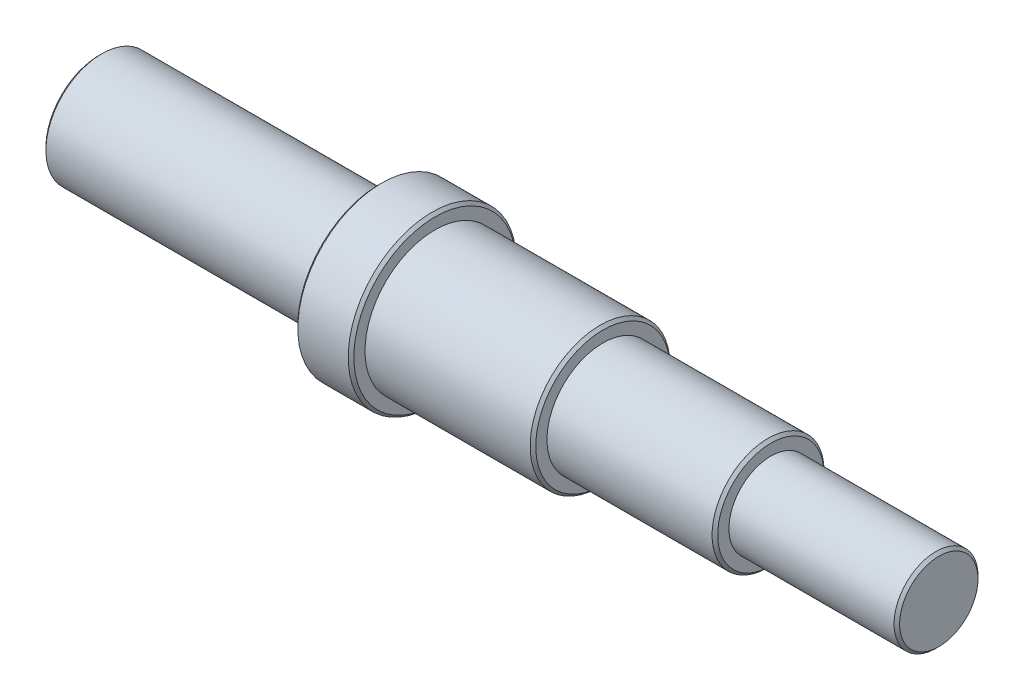
ISO-10303-21;
HEADER;
FILE_DESCRIPTION(('STEP AP214'),'2;1');
FILE_NAME('part.step','',(''),(''),'','','');
FILE_SCHEMA(('AUTOMOTIVE_DESIGN { 1 0 10303 214 1 1 1 1 }'));
ENDSEC;
DATA;
#1=APPLICATION_CONTEXT('core data for automotive mechanical design processes');
#2=APPLICATION_PROTOCOL_DEFINITION('international standard','automotive_design',2000,#1);
#3=PRODUCT_CONTEXT('',#1,'mechanical');
#4=PRODUCT('Part','Part','',(#3));
#5=PRODUCT_RELATED_PRODUCT_CATEGORY('part','',(#4));
#6=PRODUCT_DEFINITION_FORMATION('','',#4);
#7=PRODUCT_DEFINITION_CONTEXT('part definition',#1,'design');
#8=PRODUCT_DEFINITION('design','',#6,#7);
#9=PRODUCT_DEFINITION_SHAPE('','',#8);
#10=(LENGTH_UNIT() NAMED_UNIT(*) SI_UNIT(.MILLI.,.METRE.));
#11=(NAMED_UNIT(*) PLANE_ANGLE_UNIT() SI_UNIT($,.RADIAN.));
#12=(NAMED_UNIT(*) SI_UNIT($,.STERADIAN.) SOLID_ANGLE_UNIT());
#13=UNCERTAINTY_MEASURE_WITH_UNIT(LENGTH_MEASURE(1.E-05),#10,'distance_accuracy_value','');
#14=(GEOMETRIC_REPRESENTATION_CONTEXT(3) GLOBAL_UNCERTAINTY_ASSIGNED_CONTEXT((#13)) GLOBAL_UNIT_ASSIGNED_CONTEXT((#10,
#11,#12)) REPRESENTATION_CONTEXT('',''));
#15=CARTESIAN_POINT('',(0.,0.,0.));
#16=DIRECTION('',(0.,0.,1.));
#17=DIRECTION('',(1.,0.,0.));
#18=AXIS2_PLACEMENT_3D('',#15,#16,#17);
#19=CARTESIAN_POINT('',(50.,0.,0.));
#20=DIRECTION('',(-1.,0.,0.));
#21=DIRECTION('',(0.,0.,1.));
#22=AXIS2_PLACEMENT_3D('',#19,#20,#21);
#23=CYLINDRICAL_SURFACE('',#22,10.);
#24=CARTESIAN_POINT('',(0.499999999999987,0.,0.));
#25=DIRECTION('',(1.,0.,0.));
#26=DIRECTION('',(0.,0.,-1.));
#27=AXIS2_PLACEMENT_3D('',#24,#25,#26);
#28=CIRCLE('',#27,10.);
#29=CARTESIAN_POINT('',(0.499999999999987,0.,-10.));
#30=VERTEX_POINT('',#29);
#31=EDGE_CURVE('E82',#30,#30,#28,.T.);
#32=ORIENTED_EDGE('',*,*,#31,.T.);
#33=EDGE_LOOP('',(#32));
#34=FACE_BOUND('',#33,.T.);
#35=CARTESIAN_POINT('',(50.,0.,0.));
#36=DIRECTION('',(1.,0.,0.));
#37=DIRECTION('',(0.,0.,-1.));
#38=AXIS2_PLACEMENT_3D('',#35,#36,#37);
#39=CIRCLE('',#38,10.);
#40=CARTESIAN_POINT('',(50.,0.,-10.));
#41=VERTEX_POINT('',#40);
#42=EDGE_CURVE('E85',#41,#41,#39,.T.);
#43=ORIENTED_EDGE('',*,*,#42,.F.);
#44=EDGE_LOOP('',(#43));
#45=FACE_BOUND('',#44,.T.);
#46=ADVANCED_FACE('F35',(#34,#45),#23,.T.);
#47=CARTESIAN_POINT('',(0.,0.,0.));
#48=DIRECTION('',(1.,0.,0.));
#49=DIRECTION('',(0.,0.,-1.));
#50=AXIS2_PLACEMENT_3D('',#47,#48,#49);
#51=PLANE('',#50);
#52=CARTESIAN_POINT('',(0.,0.,0.));
#53=DIRECTION('',(1.,0.,0.));
#54=DIRECTION('',(0.,0.,-1.));
#55=AXIS2_PLACEMENT_3D('',#52,#53,#54);
#56=CIRCLE('',#55,9.50000000000001);
#57=CARTESIAN_POINT('',(0.,0.,-9.50000000000001));
#58=VERTEX_POINT('',#57);
#59=EDGE_CURVE('E79',#58,#58,#56,.F.);
#60=ORIENTED_EDGE('',*,*,#59,.T.);
#61=EDGE_LOOP('',(#60));
#62=FACE_BOUND('',#61,.T.);
#63=ADVANCED_FACE('F116',(#62),#51,.F.);
#64=CARTESIAN_POINT('',(0.499999999999987,0.,0.));
#65=DIRECTION('',(1.,0.,0.));
#66=DIRECTION('',(0.,0.,-1.));
#67=AXIS2_PLACEMENT_3D('',#64,#65,#66);
#68=CONICAL_SURFACE('',#67,10.,0.785398163397454);
#69=ORIENTED_EDGE('',*,*,#59,.F.);
#70=EDGE_LOOP('',(#69));
#71=FACE_BOUND('',#70,.T.);
#72=ORIENTED_EDGE('',*,*,#31,.F.);
#73=EDGE_LOOP('',(#72));
#74=FACE_BOUND('',#73,.T.);
#75=ADVANCED_FACE('F122',(#71,#74),#68,.T.);
#76=CARTESIAN_POINT('',(60.,0.,0.));
#77=DIRECTION('',(-1.,0.,0.));
#78=DIRECTION('',(0.,0.,1.));
#79=AXIS2_PLACEMENT_3D('',#76,#77,#78);
#80=CYLINDRICAL_SURFACE('',#79,15.);
#81=CARTESIAN_POINT('',(59.5,0.,0.));
#82=DIRECTION('',(1.,0.,0.));
#83=DIRECTION('',(0.,0.,-1.));
#84=AXIS2_PLACEMENT_3D('',#81,#82,#83);
#85=CIRCLE('',#84,15.);
#86=CARTESIAN_POINT('',(59.5,0.,-15.));
#87=VERTEX_POINT('',#86);
#88=EDGE_CURVE('E67',#87,#87,#85,.F.);
#89=ORIENTED_EDGE('',*,*,#88,.T.);
#90=EDGE_LOOP('',(#89));
#91=FACE_BOUND('',#90,.T.);
#92=CARTESIAN_POINT('',(50.5,0.,0.));
#93=DIRECTION('',(1.,0.,0.));
#94=DIRECTION('',(0.,0.,-1.));
#95=AXIS2_PLACEMENT_3D('',#92,#93,#94);
#96=CIRCLE('',#95,15.);
#97=CARTESIAN_POINT('',(50.5,0.,-15.));
#98=VERTEX_POINT('',#97);
#99=EDGE_CURVE('E76',#98,#98,#96,.T.);
#100=ORIENTED_EDGE('',*,*,#99,.T.);
#101=EDGE_LOOP('',(#100));
#102=FACE_BOUND('',#101,.T.);
#103=ADVANCED_FACE('F134',(#91,#102),#80,.T.);
#104=CARTESIAN_POINT('',(60.,0.,0.));
#105=DIRECTION('',(1.,0.,0.));
#106=DIRECTION('',(0.,0.,-1.));
#107=AXIS2_PLACEMENT_3D('',#104,#105,#106);
#108=PLANE('',#107);
#109=CARTESIAN_POINT('',(60.,0.,0.));
#110=DIRECTION('',(1.,0.,0.));
#111=DIRECTION('',(0.,0.,-1.));
#112=AXIS2_PLACEMENT_3D('',#109,#110,#111);
#113=CIRCLE('',#112,12.5);
#114=CARTESIAN_POINT('',(60.,0.,-12.5));
#115=VERTEX_POINT('',#114);
#116=EDGE_CURVE('E66',#115,#115,#113,.T.);
#117=ORIENTED_EDGE('',*,*,#116,.F.);
#118=EDGE_LOOP('',(#117));
#119=FACE_BOUND('',#118,.T.);
#120=CARTESIAN_POINT('',(60.,0.,0.));
#121=DIRECTION('',(1.,0.,0.));
#122=DIRECTION('',(0.,0.,-1.));
#123=AXIS2_PLACEMENT_3D('',#120,#121,#122);
#124=CIRCLE('',#123,14.5);
#125=CARTESIAN_POINT('',(60.,0.,-14.5));
#126=VERTEX_POINT('',#125);
#127=EDGE_CURVE('E70',#126,#126,#124,.T.);
#128=ORIENTED_EDGE('',*,*,#127,.T.);
#129=EDGE_LOOP('',(#128));
#130=FACE_BOUND('',#129,.T.);
#131=ADVANCED_FACE('F157',(#119,#130),#108,.T.);
#132=CARTESIAN_POINT('',(50.,0.,0.));
#133=DIRECTION('',(1.,0.,0.));
#134=DIRECTION('',(0.,0.,-1.));
#135=AXIS2_PLACEMENT_3D('',#132,#133,#134);
#136=PLANE('',#135);
#137=CARTESIAN_POINT('',(50.,0.,0.));
#138=DIRECTION('',(1.,0.,0.));
#139=DIRECTION('',(0.,0.,-1.));
#140=AXIS2_PLACEMENT_3D('',#137,#138,#139);
#141=CIRCLE('',#140,14.5);
#142=CARTESIAN_POINT('',(50.,0.,-14.5));
#143=VERTEX_POINT('',#142);
#144=EDGE_CURVE('E73',#143,#143,#141,.F.);
#145=ORIENTED_EDGE('',*,*,#144,.T.);
#146=EDGE_LOOP('',(#145));
#147=FACE_BOUND('',#146,.T.);
#148=ORIENTED_EDGE('',*,*,#42,.T.);
#149=EDGE_LOOP('',(#148));
#150=FACE_BOUND('',#149,.T.);
#151=ADVANCED_FACE('F142',(#147,#150),#136,.F.);
#152=CARTESIAN_POINT('',(50.5,0.,0.));
#153=DIRECTION('',(1.,0.,0.));
#154=DIRECTION('',(0.,0.,-1.));
#155=AXIS2_PLACEMENT_3D('',#152,#153,#154);
#156=CONICAL_SURFACE('',#155,15.,0.785398163397448);
#157=ORIENTED_EDGE('',*,*,#144,.F.);
#158=EDGE_LOOP('',(#157));
#159=FACE_BOUND('',#158,.T.);
#160=ORIENTED_EDGE('',*,*,#99,.F.);
#161=EDGE_LOOP('',(#160));
#162=FACE_BOUND('',#161,.T.);
#163=ADVANCED_FACE('F136',(#159,#162),#156,.T.);
#164=CARTESIAN_POINT('',(60.,0.,0.));
#165=DIRECTION('',(-1.,0.,0.));
#166=DIRECTION('',(0.,0.,1.));
#167=AXIS2_PLACEMENT_3D('',#164,#165,#166);
#168=CONICAL_SURFACE('',#167,14.5,0.785398163397435);
#169=ORIENTED_EDGE('',*,*,#88,.F.);
#170=EDGE_LOOP('',(#169));
#171=FACE_BOUND('',#170,.T.);
#172=ORIENTED_EDGE('',*,*,#127,.F.);
#173=EDGE_LOOP('',(#172));
#174=FACE_BOUND('',#173,.T.);
#175=ADVANCED_FACE('F141',(#171,#174),#168,.T.);
#176=CARTESIAN_POINT('',(90.,0.,0.));
#177=DIRECTION('',(-1.,0.,0.));
#178=DIRECTION('',(0.,0.,1.));
#179=AXIS2_PLACEMENT_3D('',#176,#177,#178);
#180=CYLINDRICAL_SURFACE('',#179,12.5);
#181=CARTESIAN_POINT('',(89.5,0.,0.));
#182=DIRECTION('',(1.,0.,0.));
#183=DIRECTION('',(0.,0.,-1.));
#184=AXIS2_PLACEMENT_3D('',#181,#182,#183);
#185=CIRCLE('',#184,12.5);
#186=CARTESIAN_POINT('',(89.5,0.,-12.5));
#187=VERTEX_POINT('',#186);
#188=EDGE_CURVE('E60',#187,#187,#185,.F.);
#189=ORIENTED_EDGE('',*,*,#188,.T.);
#190=EDGE_LOOP('',(#189));
#191=FACE_BOUND('',#190,.T.);
#192=ORIENTED_EDGE('',*,*,#116,.T.);
#193=EDGE_LOOP('',(#192));
#194=FACE_BOUND('',#193,.T.);
#195=ADVANCED_FACE('F99',(#191,#194),#180,.T.);
#196=CARTESIAN_POINT('',(90.,0.,0.));
#197=DIRECTION('',(1.,0.,0.));
#198=DIRECTION('',(0.,0.,-1.));
#199=AXIS2_PLACEMENT_3D('',#196,#197,#198);
#200=PLANE('',#199);
#201=CARTESIAN_POINT('',(90.,0.,0.));
#202=DIRECTION('',(1.,0.,0.));
#203=DIRECTION('',(0.,0.,-1.));
#204=AXIS2_PLACEMENT_3D('',#201,#202,#203);
#205=CIRCLE('',#204,10.);
#206=CARTESIAN_POINT('',(90.,0.,-10.));
#207=VERTEX_POINT('',#206);
#208=EDGE_CURVE('E59',#207,#207,#205,.T.);
#209=ORIENTED_EDGE('',*,*,#208,.F.);
#210=EDGE_LOOP('',(#209));
#211=FACE_BOUND('',#210,.T.);
#212=CARTESIAN_POINT('',(90.,0.,0.));
#213=DIRECTION('',(1.,0.,0.));
#214=DIRECTION('',(0.,0.,-1.));
#215=AXIS2_PLACEMENT_3D('',#212,#213,#214);
#216=CIRCLE('',#215,12.);
#217=CARTESIAN_POINT('',(90.,0.,-12.));
#218=VERTEX_POINT('',#217);
#219=EDGE_CURVE('E63',#218,#218,#216,.T.);
#220=ORIENTED_EDGE('',*,*,#219,.T.);
#221=EDGE_LOOP('',(#220));
#222=FACE_BOUND('',#221,.T.);
#223=ADVANCED_FACE('F95',(#211,#222),#200,.T.);
#224=CARTESIAN_POINT('',(90.,0.,0.));
#225=DIRECTION('',(-1.,0.,0.));
#226=DIRECTION('',(0.,0.,1.));
#227=AXIS2_PLACEMENT_3D('',#224,#225,#226);
#228=CONICAL_SURFACE('',#227,12.,0.78539816339744);
#229=ORIENTED_EDGE('',*,*,#188,.F.);
#230=EDGE_LOOP('',(#229));
#231=FACE_BOUND('',#230,.T.);
#232=ORIENTED_EDGE('',*,*,#219,.F.);
#233=EDGE_LOOP('',(#232));
#234=FACE_BOUND('',#233,.T.);
#235=ADVANCED_FACE('F98',(#231,#234),#228,.T.);
#236=CARTESIAN_POINT('',(120.,0.,0.));
#237=DIRECTION('',(-1.,0.,0.));
#238=DIRECTION('',(0.,0.,1.));
#239=AXIS2_PLACEMENT_3D('',#236,#237,#238);
#240=CYLINDRICAL_SURFACE('',#239,10.);
#241=CARTESIAN_POINT('',(119.5,0.,0.));
#242=DIRECTION('',(1.,0.,0.));
#243=DIRECTION('',(0.,0.,-1.));
#244=AXIS2_PLACEMENT_3D('',#241,#242,#243);
#245=CIRCLE('',#244,10.);
#246=CARTESIAN_POINT('',(119.5,0.,-10.));
#247=VERTEX_POINT('',#246);
#248=EDGE_CURVE('E51',#247,#247,#245,.F.);
#249=ORIENTED_EDGE('',*,*,#248,.T.);
#250=EDGE_LOOP('',(#249));
#251=FACE_BOUND('',#250,.T.);
#252=ORIENTED_EDGE('',*,*,#208,.T.);
#253=EDGE_LOOP('',(#252));
#254=FACE_BOUND('',#253,.T.);
#255=ADVANCED_FACE('F93',(#251,#254),#240,.T.);
#256=CARTESIAN_POINT('',(120.,0.,0.));
#257=DIRECTION('',(1.,0.,0.));
#258=DIRECTION('',(0.,0.,-1.));
#259=AXIS2_PLACEMENT_3D('',#256,#257,#258);
#260=PLANE('',#259);
#261=CARTESIAN_POINT('',(120.,0.,0.));
#262=DIRECTION('',(1.,0.,0.));
#263=DIRECTION('',(0.,0.,-1.));
#264=AXIS2_PLACEMENT_3D('',#261,#262,#263);
#265=CIRCLE('',#264,7.5);
#266=CARTESIAN_POINT('',(120.,0.,-7.5));
#267=VERTEX_POINT('',#266);
#268=EDGE_CURVE('E47',#267,#267,#265,.T.);
#269=ORIENTED_EDGE('',*,*,#268,.F.);
#270=EDGE_LOOP('',(#269));
#271=FACE_BOUND('',#270,.T.);
#272=CARTESIAN_POINT('',(120.,0.,0.));
#273=DIRECTION('',(1.,0.,0.));
#274=DIRECTION('',(0.,0.,-1.));
#275=AXIS2_PLACEMENT_3D('',#272,#273,#274);
#276=CIRCLE('',#275,9.49999999999999);
#277=CARTESIAN_POINT('',(120.,0.,-9.49999999999999));
#278=VERTEX_POINT('',#277);
#279=EDGE_CURVE('E56',#278,#278,#276,.T.);
#280=ORIENTED_EDGE('',*,*,#279,.T.);
#281=EDGE_LOOP('',(#280));
#282=FACE_BOUND('',#281,.T.);
#283=ADVANCED_FACE('F109',(#271,#282),#260,.T.);
#284=CARTESIAN_POINT('',(120.,0.,0.));
#285=DIRECTION('',(-1.,0.,0.));
#286=DIRECTION('',(0.,0.,1.));
#287=AXIS2_PLACEMENT_3D('',#284,#285,#286);
#288=CONICAL_SURFACE('',#287,9.49999999999999,0.785398163397454);
#289=ORIENTED_EDGE('',*,*,#248,.F.);
#290=EDGE_LOOP('',(#289));
#291=FACE_BOUND('',#290,.T.);
#292=ORIENTED_EDGE('',*,*,#279,.F.);
#293=EDGE_LOOP('',(#292));
#294=FACE_BOUND('',#293,.T.);
#295=ADVANCED_FACE('F172',(#291,#294),#288,.T.);
#296=CARTESIAN_POINT('',(150.,0.,0.));
#297=DIRECTION('',(-1.,0.,0.));
#298=DIRECTION('',(0.,0.,1.));
#299=AXIS2_PLACEMENT_3D('',#296,#297,#298);
#300=CYLINDRICAL_SURFACE('',#299,7.5);
#301=CARTESIAN_POINT('',(149.5,0.,0.));
#302=DIRECTION('',(1.,0.,0.));
#303=DIRECTION('',(0.,0.,-1.));
#304=AXIS2_PLACEMENT_3D('',#301,#302,#303);
#305=CIRCLE('',#304,7.5);
#306=CARTESIAN_POINT('',(149.5,0.,-7.5));
#307=VERTEX_POINT('',#306);
#308=EDGE_CURVE('E10',#307,#307,#305,.F.);
#309=ORIENTED_EDGE('',*,*,#308,.T.);
#310=EDGE_LOOP('',(#309));
#311=FACE_BOUND('',#310,.T.);
#312=ORIENTED_EDGE('',*,*,#268,.T.);
#313=EDGE_LOOP('',(#312));
#314=FACE_BOUND('',#313,.T.);
#315=ADVANCED_FACE('F174',(#311,#314),#300,.T.);
#316=CARTESIAN_POINT('',(150.,0.,0.));
#317=DIRECTION('',(1.,0.,0.));
#318=DIRECTION('',(0.,0.,-1.));
#319=AXIS2_PLACEMENT_3D('',#316,#317,#318);
#320=PLANE('',#319);
#321=CARTESIAN_POINT('',(150.,0.,0.));
#322=DIRECTION('',(1.,0.,0.));
#323=DIRECTION('',(0.,0.,-1.));
#324=AXIS2_PLACEMENT_3D('',#321,#322,#323);
#325=CIRCLE('',#324,7.00000000000002);
#326=CARTESIAN_POINT('',(150.,0.,-7.00000000000002));
#327=VERTEX_POINT('',#326);
#328=EDGE_CURVE('E43',#327,#327,#325,.T.);
#329=ORIENTED_EDGE('',*,*,#328,.T.);
#330=EDGE_LOOP('',(#329));
#331=FACE_BOUND('',#330,.T.);
#332=ADVANCED_FACE('F177',(#331),#320,.T.);
#333=CARTESIAN_POINT('',(150.,0.,0.));
#334=DIRECTION('',(-1.,0.,0.));
#335=DIRECTION('',(0.,0.,1.));
#336=AXIS2_PLACEMENT_3D('',#333,#334,#335);
#337=CONICAL_SURFACE('',#336,7.00000000000002,0.7853981633974);
#338=ORIENTED_EDGE('',*,*,#308,.F.);
#339=EDGE_LOOP('',(#338));
#340=FACE_BOUND('',#339,.T.);
#341=ORIENTED_EDGE('',*,*,#328,.F.);
#342=EDGE_LOOP('',(#341));
#343=FACE_BOUND('',#342,.T.);
#344=ADVANCED_FACE('F38',(#340,#343),#337,.T.);
#345=CLOSED_SHELL('',(#46,#63,#75,#103,#131,#151,#163,#175,#195,#223,#235,#255,#283,#295,#315,
#332,#344));
#346=MANIFOLD_SOLID_BREP('B2',#345);
#347=ADVANCED_BREP_SHAPE_REPRESENTATION('',(#18,#346),#14);
#348=SHAPE_DEFINITION_REPRESENTATION(#9,#347);
ENDSEC;
END-ISO-10303-21;
